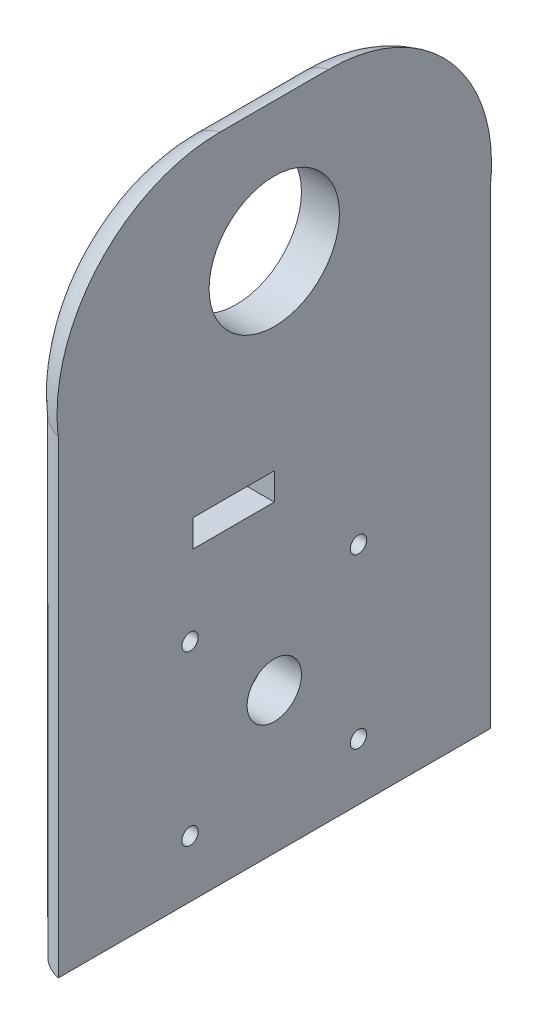
ISO-10303-21;
HEADER;
FILE_DESCRIPTION(('STEP AP214'),'2;1');
FILE_NAME('part.step','',(''),(''),'','','');
FILE_SCHEMA(('AUTOMOTIVE_DESIGN { 1 0 10303 214 1 1 1 1 }'));
ENDSEC;
DATA;
#1=APPLICATION_CONTEXT('core data for automotive mechanical design processes');
#2=APPLICATION_PROTOCOL_DEFINITION('international standard','automotive_design',2000,#1);
#3=PRODUCT_CONTEXT('',#1,'mechanical');
#4=PRODUCT('Part','Part','',(#3));
#5=PRODUCT_RELATED_PRODUCT_CATEGORY('part','',(#4));
#6=PRODUCT_DEFINITION_FORMATION('','',#4);
#7=PRODUCT_DEFINITION_CONTEXT('part definition',#1,'design');
#8=PRODUCT_DEFINITION('design','',#6,#7);
#9=PRODUCT_DEFINITION_SHAPE('','',#8);
#10=(LENGTH_UNIT() NAMED_UNIT(*) SI_UNIT(.MILLI.,.METRE.));
#11=(NAMED_UNIT(*) PLANE_ANGLE_UNIT() SI_UNIT($,.RADIAN.));
#12=(NAMED_UNIT(*) SI_UNIT($,.STERADIAN.) SOLID_ANGLE_UNIT());
#13=UNCERTAINTY_MEASURE_WITH_UNIT(LENGTH_MEASURE(1.E-05),#10,'distance_accuracy_value','');
#14=(GEOMETRIC_REPRESENTATION_CONTEXT(3) GLOBAL_UNCERTAINTY_ASSIGNED_CONTEXT((#13)) GLOBAL_UNIT_ASSIGNED_CONTEXT((#10,
#11,#12)) REPRESENTATION_CONTEXT('',''));
#15=CARTESIAN_POINT('',(0.,0.,0.));
#16=DIRECTION('',(0.,0.,1.));
#17=DIRECTION('',(1.,0.,0.));
#18=AXIS2_PLACEMENT_3D('',#15,#16,#17);
#19=CARTESIAN_POINT('',(7.00000000000001,0.,0.));
#20=DIRECTION('',(1.,0.,0.));
#21=DIRECTION('',(0.,0.,-1.));
#22=AXIS2_PLACEMENT_3D('',#19,#20,#21);
#23=PLANE('',#22);
#24=DIRECTION('',(0.,-1.,0.));
#25=VECTOR('',#24,1.);
#26=CARTESIAN_POINT('',(7.00000000000001,86.3323719205008,-0.22503561260788));
#27=LINE('',#26,#25);
#28=CARTESIAN_POINT('',(7.00000000000001,86.3323719205008,-0.22503561260788));
#29=VERTEX_POINT('',#28);
#30=CARTESIAN_POINT('',(7.00000000000001,0.,-0.225035612607876));
#31=VERTEX_POINT('',#30);
#32=EDGE_CURVE('E134',#29,#31,#27,.T.);
#33=ORIENTED_EDGE('',*,*,#32,.T.);
#34=DIRECTION('',(0.,0.,1.));
#35=VECTOR('',#34,1.);
#36=CARTESIAN_POINT('',(7.00000000000001,0.,0.));
#37=LINE('',#36,#35);
#38=CARTESIAN_POINT('',(7.,0.,-79.7749643873921));
#39=VERTEX_POINT('',#38);
#40=EDGE_CURVE('E137',#39,#31,#37,.T.);
#41=ORIENTED_EDGE('',*,*,#40,.F.);
#42=DIRECTION('',(0.,-1.,0.));
#43=VECTOR('',#42,1.);
#44=CARTESIAN_POINT('',(7.,80.,-79.7749643873921));
#45=LINE('',#44,#43);
#46=CARTESIAN_POINT('',(7.,86.332371920501,-79.7749643873921));
#47=VERTEX_POINT('',#46);
#48=EDGE_CURVE('E123',#39,#47,#45,.F.);
#49=ORIENTED_EDGE('',*,*,#48,.T.);
#50=CARTESIAN_POINT('',(7.,86.332371920501,-79.7749643873921));
#51=CARTESIAN_POINT('',(7.,86.4844238117171,-79.7936939732408));
#52=CARTESIAN_POINT('',(7.,86.6366191929731,-79.81125864016));
#53=CARTESIAN_POINT('',(7.,86.9412611686345,-79.8440544455172));
#54=CARTESIAN_POINT('',(7.,87.09370776304,-79.8592855839552));
#55=CARTESIAN_POINT('',(7.,87.3988163980702,-79.8874106417278));
#56=CARTESIAN_POINT('',(7.,87.5514784386949,-79.9003045610624));
#57=CARTESIAN_POINT('',(7.,87.8569821328588,-79.9237521860107));
#58=CARTESIAN_POINT('',(7.,88.0098237863979,-79.9343058916245));
#59=CARTESIAN_POINT('',(7.,88.3156508352067,-79.9530706016193));
#60=CARTESIAN_POINT('',(7.,88.4686362304764,-79.9612816060004));
#61=CARTESIAN_POINT('',(7.,88.7747148565299,-79.9753589969771));
#62=CARTESIAN_POINT('',(7.,88.9278080873137,-79.9812253835727));
#63=CARTESIAN_POINT('',(7.,89.2340664537782,-79.9906121303581));
#64=CARTESIAN_POINT('',(7.,89.3872315894588,-79.9941324905479));
#65=CARTESIAN_POINT('',(7.,89.6935978158869,-79.9988264748));
#66=CARTESIAN_POINT('',(7.,89.8467989066343,-80.0000000988623));
#67=CARTESIAN_POINT('',(7.,90.,-80.));
#68=B_SPLINE_CURVE_WITH_KNOTS('',3,(#50,#51,#52,#53,#54,#55,#56,#57,#58,#59,#60,#61,#62,#63,#64,
#65,#66,#67),.UNSPECIFIED.,.F.,.F.,(4,2,2,2,2,2,2,2,4),(0.,0.459598781070504,0.919197562141005,
1.37879634321148,1.83839512428197,2.29799390535247,2.75759268642297,3.21719146749346,
3.67679024856396),.UNSPECIFIED.);
#69=CARTESIAN_POINT('',(7.,90.,-80.));
#70=VERTEX_POINT('',#69);
#71=EDGE_CURVE('E142',#47,#70,#68,.T.);
#72=ORIENTED_EDGE('',*,*,#71,.T.);
#73=CARTESIAN_POINT('',(7.,90.,-50.));
#74=DIRECTION('',(-1.,0.,0.));
#75=DIRECTION('',(0.,0.,1.));
#76=AXIS2_PLACEMENT_3D('',#73,#74,#75);
#77=CIRCLE('',#76,30.);
#78=CARTESIAN_POINT('',(7.,120.,-50.));
#79=VERTEX_POINT('',#78);
#80=EDGE_CURVE('E210',#70,#79,#77,.F.);
#81=ORIENTED_EDGE('',*,*,#80,.T.);
#82=DIRECTION('',(0.,0.,-1.));
#83=VECTOR('',#82,1.);
#84=CARTESIAN_POINT('',(7.,120.,-80.));
#85=LINE('',#84,#83);
#86=CARTESIAN_POINT('',(7.,120.,-30.));
#87=VERTEX_POINT('',#86);
#88=EDGE_CURVE('E209',#87,#79,#85,.T.);
#89=ORIENTED_EDGE('',*,*,#88,.F.);
#90=CARTESIAN_POINT('',(7.,90.,-30.));
#91=DIRECTION('',(-1.,0.,0.));
#92=DIRECTION('',(0.,0.,1.));
#93=AXIS2_PLACEMENT_3D('',#90,#91,#92);
#94=CIRCLE('',#93,30.);
#95=CARTESIAN_POINT('',(7.00000000000001,90.,0.));
#96=VERTEX_POINT('',#95);
#97=EDGE_CURVE('E230',#87,#96,#94,.F.);
#98=ORIENTED_EDGE('',*,*,#97,.T.);
#99=CARTESIAN_POINT('',(7.00000000000001,90.,0.));
#100=CARTESIAN_POINT('',(7.00000000000001,89.8467989066343,9.88623379219707E-08));
#101=CARTESIAN_POINT('',(7.00000000000001,89.6935978158869,-0.00117352519996322));
#102=CARTESIAN_POINT('',(7.00000000000001,89.3872315894588,-0.00586750945208815));
#103=CARTESIAN_POINT('',(7.00000000000001,89.2340664537781,-0.00938786964191195));
#104=CARTESIAN_POINT('',(7.00000000000001,88.9278080873136,-0.0187746164273267));
#105=CARTESIAN_POINT('',(7.00000000000001,88.7747148565298,-0.0246410030229177));
#106=CARTESIAN_POINT('',(7.00000000000001,88.4686362304763,-0.0387183939996002));
#107=CARTESIAN_POINT('',(7.00000000000001,88.3156508352066,-0.0469293983806916));
#108=CARTESIAN_POINT('',(7.00000000000001,88.0098237863978,-0.0656941083755351));
#109=CARTESIAN_POINT('',(7.00000000000001,87.8569821328587,-0.0762478139892872));
#110=CARTESIAN_POINT('',(7.00000000000001,87.5514784386948,-0.0996954389376256));
#111=CARTESIAN_POINT('',(7.00000000000001,87.3988163980701,-0.112589358272212));
#112=CARTESIAN_POINT('',(7.00000000000001,87.0937077630398,-0.140714416044798));
#113=CARTESIAN_POINT('',(7.00000000000001,86.9412611686343,-0.155945554482799));
#114=CARTESIAN_POINT('',(7.00000000000001,86.6366191929729,-0.188741359839996));
#115=CARTESIAN_POINT('',(7.00000000000001,86.4844238117169,-0.206306026759193));
#116=CARTESIAN_POINT('',(7.00000000000001,86.3323719205008,-0.22503561260788));
#117=B_SPLINE_CURVE_WITH_KNOTS('',3,(#99,#100,#101,#102,#103,#104,#105,#106,#107,#108,#109,#110,
#111,#112,#113,#114,#115,#116),.UNSPECIFIED.,.F.,.F.,(4,2,2,2,2,2,2,2,4),(0.,0.459598781070525,
0.919197562141053,1.37879634321158,1.8383951242821,2.29799390535263,2.75759268642314,
3.21719146749367,3.67679024856419),.UNSPECIFIED.);
#118=EDGE_CURVE('E327',#96,#29,#117,.T.);
#119=ORIENTED_EDGE('',*,*,#118,.T.);
#120=EDGE_LOOP('',(#33,#41,#49,#72,#81,#89,#98,#119));
#121=FACE_BOUND('',#120,.T.);
#122=CARTESIAN_POINT('',(7.00000000000001,96.,-40.));
#123=DIRECTION('',(-1.,0.,0.));
#124=DIRECTION('',(0.,0.,1.));
#125=AXIS2_PLACEMENT_3D('',#122,#123,#124);
#126=CIRCLE('',#125,12.);
#127=CARTESIAN_POINT('',(7.00000000000001,96.,-28.));
#128=VERTEX_POINT('',#127);
#129=EDGE_CURVE('E260',#128,#128,#126,.T.);
#130=ORIENTED_EDGE('',*,*,#129,.T.);
#131=EDGE_LOOP('',(#130));
#132=FACE_BOUND('',#131,.T.);
#133=CARTESIAN_POINT('',(7.00000000000001,10.5,-55.5000000000003));
#134=DIRECTION('',(-1.,0.,0.));
#135=DIRECTION('',(0.,0.,1.));
#136=AXIS2_PLACEMENT_3D('',#133,#134,#135);
#137=CIRCLE('',#136,1.5);
#138=CARTESIAN_POINT('',(7.00000000000001,10.5,-54.0000000000003));
#139=VERTEX_POINT('',#138);
#140=EDGE_CURVE('E257',#139,#139,#137,.T.);
#141=ORIENTED_EDGE('',*,*,#140,.T.);
#142=EDGE_LOOP('',(#141));
#143=FACE_BOUND('',#142,.T.);
#144=CARTESIAN_POINT('',(7.00000000000001,10.5,-24.5000000000003));
#145=DIRECTION('',(-1.,0.,0.));
#146=DIRECTION('',(0.,0.,1.));
#147=AXIS2_PLACEMENT_3D('',#144,#145,#146);
#148=CIRCLE('',#147,1.5);
#149=CARTESIAN_POINT('',(7.00000000000001,10.5,-23.0000000000003));
#150=VERTEX_POINT('',#149);
#151=EDGE_CURVE('E254',#150,#150,#148,.T.);
#152=ORIENTED_EDGE('',*,*,#151,.T.);
#153=EDGE_LOOP('',(#152));
#154=FACE_BOUND('',#153,.T.);
#155=DIRECTION('',(0.,0.,-1.));
#156=VECTOR('',#155,1.);
#157=CARTESIAN_POINT('',(7.,61.,-80.));
#158=LINE('',#157,#156);
#159=CARTESIAN_POINT('',(7.00000000000001,61.,-25.));
#160=VERTEX_POINT('',#159);
#161=CARTESIAN_POINT('',(7.,61.,-40.));
#162=VERTEX_POINT('',#161);
#163=EDGE_CURVE('E251',#160,#162,#158,.T.);
#164=ORIENTED_EDGE('',*,*,#163,.T.);
#165=DIRECTION('',(0.,-1.,0.));
#166=VECTOR('',#165,1.);
#167=CARTESIAN_POINT('',(7.,120.,-40.0000000000002));
#168=LINE('',#167,#166);
#169=CARTESIAN_POINT('',(7.00000000000001,56.,-40.));
#170=VERTEX_POINT('',#169);
#171=EDGE_CURVE('E244',#162,#170,#168,.T.);
#172=ORIENTED_EDGE('',*,*,#171,.T.);
#173=DIRECTION('',(0.,0.,1.));
#174=VECTOR('',#173,1.);
#175=CARTESIAN_POINT('',(7.,56.,-80.));
#176=LINE('',#175,#174);
#177=CARTESIAN_POINT('',(7.00000000000001,56.,-25.));
#178=VERTEX_POINT('',#177);
#179=EDGE_CURVE('E246',#170,#178,#176,.T.);
#180=ORIENTED_EDGE('',*,*,#179,.T.);
#181=DIRECTION('',(0.,1.,0.));
#182=VECTOR('',#181,1.);
#183=CARTESIAN_POINT('',(7.00000000000001,120.,-25.));
#184=LINE('',#183,#182);
#185=EDGE_CURVE('E248',#178,#160,#184,.T.);
#186=ORIENTED_EDGE('',*,*,#185,.T.);
#187=EDGE_LOOP('',(#164,#172,#180,#186));
#188=FACE_BOUND('',#187,.T.);
#189=CARTESIAN_POINT('',(7.00000000000001,26.,-40.));
#190=DIRECTION('',(-1.,0.,0.));
#191=DIRECTION('',(0.,0.,1.));
#192=AXIS2_PLACEMENT_3D('',#189,#190,#191);
#193=CIRCLE('',#192,5.);
#194=CARTESIAN_POINT('',(7.00000000000001,26.,-35.));
#195=VERTEX_POINT('',#194);
#196=EDGE_CURVE('E241',#195,#195,#193,.T.);
#197=ORIENTED_EDGE('',*,*,#196,.T.);
#198=EDGE_LOOP('',(#197));
#199=FACE_BOUND('',#198,.T.);
#200=CARTESIAN_POINT('',(7.00000000000001,41.5,-24.5));
#201=DIRECTION('',(-1.,0.,0.));
#202=DIRECTION('',(0.,0.,1.));
#203=AXIS2_PLACEMENT_3D('',#200,#201,#202);
#204=CIRCLE('',#203,1.5);
#205=CARTESIAN_POINT('',(7.00000000000001,41.5,-23.));
#206=VERTEX_POINT('',#205);
#207=EDGE_CURVE('E238',#206,#206,#204,.T.);
#208=ORIENTED_EDGE('',*,*,#207,.T.);
#209=EDGE_LOOP('',(#208));
#210=FACE_BOUND('',#209,.T.);
#211=CARTESIAN_POINT('',(7.00000000000001,41.5,-55.5));
#212=DIRECTION('',(-1.,0.,0.));
#213=DIRECTION('',(0.,0.,1.));
#214=AXIS2_PLACEMENT_3D('',#211,#212,#213);
#215=CIRCLE('',#214,1.5);
#216=CARTESIAN_POINT('',(7.00000000000001,41.5,-54.));
#217=VERTEX_POINT('',#216);
#218=EDGE_CURVE('E235',#217,#217,#215,.T.);
#219=ORIENTED_EDGE('',*,*,#218,.T.);
#220=EDGE_LOOP('',(#219));
#221=FACE_BOUND('',#220,.T.);
#222=ADVANCED_FACE('F40',(#121,#132,#143,#154,#188,#199,#210,#221),#23,.T.);
#223=CARTESIAN_POINT('',(0.,0.,0.));
#224=DIRECTION('',(0.,-1.,0.));
#225=DIRECTION('',(0.,0.,-1.));
#226=AXIS2_PLACEMENT_3D('',#223,#224,#225);
#227=PLANE('',#226);
#228=CARTESIAN_POINT('',(9.,0.,-71.));
#229=DIRECTION('',(0.,-1.,0.));
#230=DIRECTION('',(0.,0.,-1.));
#231=AXIS2_PLACEMENT_3D('',#228,#229,#230);
#232=CIRCLE('',#231,9.);
#233=CARTESIAN_POINT('',(0.,0.,-71.));
#234=VERTEX_POINT('',#233);
#235=EDGE_CURVE('E128',#234,#39,#232,.T.);
#236=ORIENTED_EDGE('',*,*,#235,.T.);
#237=ORIENTED_EDGE('',*,*,#40,.T.);
#238=CARTESIAN_POINT('',(9.,0.,-9.));
#239=DIRECTION('',(0.,-1.,0.));
#240=DIRECTION('',(0.,0.,-1.));
#241=AXIS2_PLACEMENT_3D('',#238,#239,#240);
#242=CIRCLE('',#241,9.);
#243=CARTESIAN_POINT('',(0.,0.,-9.));
#244=VERTEX_POINT('',#243);
#245=EDGE_CURVE('E133',#31,#244,#242,.T.);
#246=ORIENTED_EDGE('',*,*,#245,.T.);
#247=DIRECTION('',(0.,0.,1.));
#248=VECTOR('',#247,1.);
#249=CARTESIAN_POINT('',(0.,0.,0.));
#250=LINE('',#249,#248);
#251=EDGE_CURVE('E147',#234,#244,#250,.T.);
#252=ORIENTED_EDGE('',*,*,#251,.F.);
#253=EDGE_LOOP('',(#236,#237,#246,#252));
#254=FACE_BOUND('',#253,.T.);
#255=ADVANCED_FACE('F145',(#254),#227,.T.);
#256=CARTESIAN_POINT('',(9.,80.,-71.));
#257=DIRECTION('',(0.,-1.,0.));
#258=DIRECTION('',(0.,0.,-1.));
#259=AXIS2_PLACEMENT_3D('',#256,#257,#258);
#260=CYLINDRICAL_SURFACE('',#259,9.);
#261=ORIENTED_EDGE('',*,*,#48,.F.);
#262=ORIENTED_EDGE('',*,*,#235,.F.);
#263=DIRECTION('',(0.,-1.,0.));
#264=VECTOR('',#263,1.);
#265=CARTESIAN_POINT('',(0.,80.,-71.));
#266=LINE('',#265,#264);
#267=CARTESIAN_POINT('',(0.,86.9174463903328,-71.));
#268=VERTEX_POINT('',#267);
#269=EDGE_CURVE('E208',#268,#234,#266,.T.);
#270=ORIENTED_EDGE('',*,*,#269,.F.);
#271=CARTESIAN_POINT('',(17.1120658559973,86.6449272075602,-74.8979978896816));
#272=CARTESIAN_POINT('',(17.0025233549063,86.6296322569458,-75.126027909353));
#273=CARTESIAN_POINT('',(16.8833093516158,86.6147524338567,-75.3494352765005));
#274=CARTESIAN_POINT('',(16.6264828009461,86.5858905522271,-75.7854619530367));
#275=CARTESIAN_POINT('',(16.4888709390154,86.5719084602686,-75.9980816639339));
#276=CARTESIAN_POINT('',(16.1962768271869,86.5449168876101,-76.4108777012592));
#277=CARTESIAN_POINT('',(16.0413055512613,86.5319068010203,-76.6110617659807));
#278=CARTESIAN_POINT('',(15.7150236659178,86.5069087819546,-76.9977024433949));
#279=CARTESIAN_POINT('',(15.5437133018826,86.4949208341331,-77.184159262171));
#280=CARTESIAN_POINT('',(15.1858667018349,86.4720145848228,-77.5421046415927));
#281=CARTESIAN_POINT('',(14.9993226877017,86.4610968361041,-77.7135854620305));
#282=CARTESIAN_POINT('',(14.612403383978,86.4403855338573,-78.0402437370061));
#283=CARTESIAN_POINT('',(14.4120278193592,86.4305920026937,-78.1954208672043));
#284=CARTESIAN_POINT('',(13.9989178795064,86.4121735857264,-78.4883187674557));
#285=CARTESIAN_POINT('',(13.7861863065341,86.4035484364086,-78.6260434732346));
#286=CARTESIAN_POINT('',(13.349836985107,86.3875007180007,-78.8830854002579));
#287=CARTESIAN_POINT('',(13.1262193037495,86.3800781414996,-79.0024027349386));
#288=CARTESIAN_POINT('',(12.6700052541864,86.3664759361732,-79.2216190464963));
#289=CARTESIAN_POINT('',(12.4374217339087,86.3602946022055,-79.321544656101));
#290=CARTESIAN_POINT('',(11.964641307076,86.349187554692,-79.5014630660415));
#291=CARTESIAN_POINT('',(11.7244444548299,86.3442618321918,-79.5814560085285));
#292=CARTESIAN_POINT('',(11.2381129057099,86.3356854899489,-79.7209433755051));
#293=CARTESIAN_POINT('',(10.9919773996816,86.3320350450265,-79.7804349895742));
#294=CARTESIAN_POINT('',(10.4955554478808,86.3260250303049,-79.8784753572502));
#295=CARTESIAN_POINT('',(10.2452690251416,86.3236654533453,-79.9170242270274));
#296=CARTESIAN_POINT('',(9.74431392869058,86.3202601593651,-79.9726812940555));
#297=CARTESIAN_POINT('',(9.4936638190599,86.31920423253,-79.9899561009667));
#298=CARTESIAN_POINT('',(8.99170947974394,86.3183763655687,-80.0034986192258));
#299=CARTESIAN_POINT('',(8.74040505809832,86.3186048582341,-79.9997592497416));
#300=CARTESIAN_POINT('',(8.23905337704522,86.3203457310569,-79.9712867665032));
#301=CARTESIAN_POINT('',(7.98900583062906,86.3218578033339,-79.9465586871199));
#302=CARTESIAN_POINT('',(7.49185781078122,86.3261594615022,-79.8762904680205));
#303=CARTESIAN_POINT('',(7.24475740839572,86.3289490781274,-79.8307498276167));
#304=CARTESIAN_POINT('',(6.75349666677686,86.3358191789912,-79.7187810136147));
#305=CARTESIAN_POINT('',(6.50936987326081,86.3399087294127,-79.6522061605287));
#306=CARTESIAN_POINT('',(6.02760776945707,86.3493558027826,-79.4987526092848));
#307=CARTESIAN_POINT('',(5.78997249183444,86.3547133321102,-79.4118738089795));
#308=CARTESIAN_POINT('',(5.32288411110817,86.3666744206638,-79.2184375479486));
#309=CARTESIAN_POINT('',(5.09343098861722,86.3732779769373,-79.1118801338545));
#310=CARTESIAN_POINT('',(4.64434027508894,86.3877037044129,-78.8798544909191));
#311=CARTESIAN_POINT('',(4.42470248766182,86.3955258512188,-78.7543866406664));
#312=CARTESIAN_POINT('',(3.99679842431334,86.4123560268681,-78.4854412855514));
#313=CARTESIAN_POINT('',(3.78853194907225,86.4213640349159,-78.3419640965077));
#314=CARTESIAN_POINT('',(3.38490974700962,86.4405245813919,-78.0380788554198));
#315=CARTESIAN_POINT('',(3.18954961168861,86.4506767257704,-77.877676633697));
#316=CARTESIAN_POINT('',(2.81295144023854,86.4720894553229,-77.5409678211372));
#317=CARTESIAN_POINT('',(2.63172014166022,86.4833505636003,-77.3646537279067));
#318=CARTESIAN_POINT('',(2.28476376660721,86.5069275233157,-76.997449923066));
#319=CARTESIAN_POINT('',(2.11903836840218,86.5192433528592,-76.8065605140267));
#320=CARTESIAN_POINT('',(1.80398551017772,86.5448966978584,-76.4112264095434));
#321=CARTESIAN_POINT('',(1.65468656391395,86.5582359237308,-76.2067591013461));
#322=CARTESIAN_POINT('',(1.37386554890301,86.5858559068859,-75.7860257037704));
#323=CARTESIAN_POINT('',(1.24234324169172,86.6001366515348,-75.5697597727189));
#324=CARTESIAN_POINT('',(0.998139712007094,86.6295549160713,-75.1272295084597));
#325=CARTESIAN_POINT('',(0.88543645698999,86.644691405887,-74.9009772649655));
#326=CARTESIAN_POINT('',(0.679506285843596,86.6757571380358,-74.4399281942448));
#327=CARTESIAN_POINT('',(0.586272446007552,86.6916860960478,-74.2051344395454));
#328=CARTESIAN_POINT('',(0.416767962926865,86.7248705452736,-73.7196823067576));
#329=CARTESIAN_POINT('',(0.341260893375457,86.7421533608764,-73.4687589230089));
#330=CARTESIAN_POINT('',(0.212449436714814,86.7773845359987,-72.9614754715356));
#331=CARTESIAN_POINT('',(0.159131658048242,86.795332486955,-72.7051187813631));
#332=CARTESIAN_POINT('',(0.0794519027059349,86.8298766344923,-72.2159833983466));
#333=CARTESIAN_POINT('',(0.0508439140784731,86.8464163538502,-71.9835620497173));
#334=CARTESIAN_POINT('',(0.0118366197095676,86.8798661096679,-71.5172945099493));
#335=CARTESIAN_POINT('',(0.00142754890707298,86.8967759425993,-71.2834491505363));
#336=CARTESIAN_POINT('',(4.56127275312073E-05,86.9150304592026,-71.0331033051339));
#337=CARTESIAN_POINT('',(-5.15878953618364E-08,86.9162380887258,-71.0165513764534));
#338=CARTESIAN_POINT('',(0.,86.9174463903328,-71.));
#339=B_SPLINE_CURVE_WITH_KNOTS('',3,(#271,#272,#273,#274,#275,#276,#277,#278,#279,#280,#281,
#282,#283,#284,#285,#286,#287,#288,#289,#290,#291,#292,#293,#294,#295,#296,#297,#298,#299,#300,
#301,#302,#303,#304,#305,#306,#307,#308,#309,#310,#311,#312,#313,#314,#315,#316,#317,#318,#319,
#320,#321,#322,#323,#324,#325,#326,#327,#328,#329,#330,#331,#332,#333,#334,#335,#336,#337,#338),
.UNSPECIFIED.,.F.,.F.,(4,2,2,2,2,2,2,2,2,2,2,2,2,2,2,2,2,2,2,2,2,2,2,2,2,2,2,2,2,2,2,2,2,4),(0.,
0.760086418244916,1.5201445258547,2.2797248362133,3.03929374087657,3.79925292677073,
4.55922722814799,5.31902984027922,6.0788277699062,6.83757468581152,7.59631619050568,
8.35516166579197,9.11400293169017,9.8668626769478,10.6199761172796,11.3729089661763,
12.1258599293269,12.8841819077575,13.6425077013302,14.4008316979581,15.1591405148869,
15.9174360356837,16.6754711870204,17.4338656355216,18.1922443446835,18.9519193755602,
19.7115842147901,20.4703533384076,21.2288521675555,22.0156788673609,22.8020300148469,
23.5056404531504,24.2088732365832,24.258660905081),.UNSPECIFIED.);
#340=EDGE_CURVE('E130',#47,#268,#339,.T.);
#341=ORIENTED_EDGE('',*,*,#340,.F.);
#342=EDGE_LOOP('',(#261,#262,#270,#341));
#343=FACE_BOUND('',#342,.T.);
#344=ADVANCED_FACE('F125',(#343),#260,.T.);
#345=CARTESIAN_POINT('',(9.,80.,-9.));
#346=DIRECTION('',(0.,-1.,0.));
#347=DIRECTION('',(0.,0.,-1.));
#348=AXIS2_PLACEMENT_3D('',#345,#346,#347);
#349=CYLINDRICAL_SURFACE('',#348,9.);
#350=ORIENTED_EDGE('',*,*,#245,.F.);
#351=ORIENTED_EDGE('',*,*,#32,.F.);
#352=CARTESIAN_POINT('',(17.1120658559973,86.6449272075601,-5.10200211031836));
#353=CARTESIAN_POINT('',(17.0025233549063,86.6296322569458,-4.87397209064698));
#354=CARTESIAN_POINT('',(16.8833093516158,86.6147524338566,-4.6505647234995));
#355=CARTESIAN_POINT('',(16.6264828009461,86.5858905522271,-4.21453804696332));
#356=CARTESIAN_POINT('',(16.4888709390154,86.5719084602686,-4.00191833606607));
#357=CARTESIAN_POINT('',(16.1962768271869,86.54491688761,-3.5891222987408));
#358=CARTESIAN_POINT('',(16.0413055512613,86.5319068010203,-3.38893823401933));
#359=CARTESIAN_POINT('',(15.7150236659178,86.5069087819546,-3.00229755660509));
#360=CARTESIAN_POINT('',(15.5437133018826,86.494920834133,-2.81584073782898));
#361=CARTESIAN_POINT('',(15.1858667018348,86.4720145848228,-2.45789535840729));
#362=CARTESIAN_POINT('',(14.9993226877017,86.461096836104,-2.2864145379695));
#363=CARTESIAN_POINT('',(14.612403383978,86.4403855338573,-1.95975626299391));
#364=CARTESIAN_POINT('',(14.4120278193592,86.4305920026937,-1.80457913279566));
#365=CARTESIAN_POINT('',(13.9989178795064,86.4121735857264,-1.51168123254431));
#366=CARTESIAN_POINT('',(13.786186306534,86.4035484364086,-1.37395652676544));
#367=CARTESIAN_POINT('',(13.349836985107,86.3875007180006,-1.11691459974209));
#368=CARTESIAN_POINT('',(13.1262193037495,86.3800781414995,-0.997597265061363));
#369=CARTESIAN_POINT('',(12.6700052541864,86.3664759361732,-0.778380953503677));
#370=CARTESIAN_POINT('',(12.4374217339086,86.3602946022055,-0.678455343899008));
#371=CARTESIAN_POINT('',(11.964641307076,86.349187554692,-0.498536933958522));
#372=CARTESIAN_POINT('',(11.7244444548298,86.3442618321917,-0.418543991471506));
#373=CARTESIAN_POINT('',(11.2381129057099,86.3356854899488,-0.279056624494874));
#374=CARTESIAN_POINT('',(10.9919773996816,86.3320350450265,-0.219565010425816));
#375=CARTESIAN_POINT('',(10.4955554478808,86.3260250303049,-0.1215246427498));
#376=CARTESIAN_POINT('',(10.2452690251416,86.3236654533452,-0.0829757729726319));
#377=CARTESIAN_POINT('',(9.74431392869055,86.3202601593651,-0.0273187059444969));
#378=CARTESIAN_POINT('',(9.49366381905988,86.3192042325299,-0.0100438990332734));
#379=CARTESIAN_POINT('',(8.99170947974393,86.3183763655686,0.00349861922583641));
#380=CARTESIAN_POINT('',(8.74040505809831,86.318604858234,-0.000240750258406406));
#381=CARTESIAN_POINT('',(8.23905337704521,86.3203457310569,-0.0287132334968042));
#382=CARTESIAN_POINT('',(7.98900583062906,86.3218578033338,-0.0534413128801237));
#383=CARTESIAN_POINT('',(7.49185781078123,86.3261594615021,-0.123709531979558));
#384=CARTESIAN_POINT('',(7.24475740839573,86.3289490781273,-0.169250172383311));
#385=CARTESIAN_POINT('',(6.75349666677687,86.3358191789912,-0.28121898638524));
#386=CARTESIAN_POINT('',(6.50936987326082,86.3399087294126,-0.347793839471335));
#387=CARTESIAN_POINT('',(6.02760776945709,86.3493558027826,-0.501247390715169));
#388=CARTESIAN_POINT('',(5.78997249183445,86.3547133321101,-0.588126191020517));
#389=CARTESIAN_POINT('',(5.32288411110818,86.3666744206638,-0.781562452051414));
#390=CARTESIAN_POINT('',(5.09343098861723,86.3732779769372,-0.888119866145507));
#391=CARTESIAN_POINT('',(4.64434027508895,86.3877037044128,-1.12014550908094));
#392=CARTESIAN_POINT('',(4.42470248766182,86.3955258512188,-1.24561335933364));
#393=CARTESIAN_POINT('',(3.99679842431335,86.4123560268681,-1.51455871444858));
#394=CARTESIAN_POINT('',(3.78853194907226,86.4213640349159,-1.65803590349227));
#395=CARTESIAN_POINT('',(3.38490974700963,86.4405245813918,-1.96192114458023));
#396=CARTESIAN_POINT('',(3.18954961168862,86.4506767257704,-2.12232336630304));
#397=CARTESIAN_POINT('',(2.81295144023856,86.4720894553229,-2.4590321788628));
#398=CARTESIAN_POINT('',(2.63172014166024,86.4833505636003,-2.63534627209325));
#399=CARTESIAN_POINT('',(2.28476376660722,86.5069275233157,-3.00255007693401));
#400=CARTESIAN_POINT('',(2.1190383684022,86.5192433528592,-3.19343948597328));
#401=CARTESIAN_POINT('',(1.80398551017774,86.5448966978584,-3.58877359045655));
#402=CARTESIAN_POINT('',(1.65468656391396,86.5582359237308,-3.7932408986539));
#403=CARTESIAN_POINT('',(1.37386554890303,86.5858559068859,-4.21397429622961));
#404=CARTESIAN_POINT('',(1.24234324169174,86.6001366515348,-4.43024022728109));
#405=CARTESIAN_POINT('',(0.998139712007106,86.6295549160712,-4.87277049154031));
#406=CARTESIAN_POINT('',(0.885436456989999,86.6446914058869,-5.09902273503447));
#407=CARTESIAN_POINT('',(0.679506285843603,86.6757571380357,-5.56007180575518));
#408=CARTESIAN_POINT('',(0.586272446007558,86.6916860960478,-5.79486556045458));
#409=CARTESIAN_POINT('',(0.416767962926874,86.7248705452736,-6.28031769324242));
#410=CARTESIAN_POINT('',(0.341260893375469,86.7421533608762,-6.53124107699109));
#411=CARTESIAN_POINT('',(0.212449436714829,86.7773845359988,-7.03852452846431));
#412=CARTESIAN_POINT('',(0.159131658048257,86.7953324869556,-7.29488121863677));
#413=CARTESIAN_POINT('',(0.0794519027059451,86.8298766344916,-7.78401660165337));
#414=CARTESIAN_POINT('',(0.0508439140784815,86.846416353848,-8.01643795028275));
#415=CARTESIAN_POINT('',(0.0118366197095665,86.8798661096697,-8.48270549005058));
#416=CARTESIAN_POINT('',(0.00142754890706441,86.8967759426065,-8.7165508494632));
#417=CARTESIAN_POINT('',(4.56127275301204E-05,86.9150304592035,-8.96689669486603));
#418=CARTESIAN_POINT('',(-5.15878958843369E-08,86.9162380887264,-8.98344862354661));
#419=CARTESIAN_POINT('',(0.,86.9174463903327,-9.));
#420=B_SPLINE_CURVE_WITH_KNOTS('',3,(#352,#353,#354,#355,#356,#357,#358,#359,#360,#361,#362,
#363,#364,#365,#366,#367,#368,#369,#370,#371,#372,#373,#374,#375,#376,#377,#378,#379,#380,#381,
#382,#383,#384,#385,#386,#387,#388,#389,#390,#391,#392,#393,#394,#395,#396,#397,#398,#399,#400,
#401,#402,#403,#404,#405,#406,#407,#408,#409,#410,#411,#412,#413,#414,#415,#416,#417,#418,#419),
.UNSPECIFIED.,.F.,.F.,(4,2,2,2,2,2,2,2,2,2,2,2,2,2,2,2,2,2,2,2,2,2,2,2,2,2,2,2,2,2,2,2,2,4),(0.,
0.760086418244919,1.5201445258547,2.27972483621332,3.03929374087658,3.79925292677074,
4.559227228148,5.31902984027923,6.07882776990622,6.83757468581154,7.5963161905057,
8.35516166579199,9.11400293169019,9.86686267694781,10.6199761172796,11.3729089661763,
12.1258599293268,12.8841819077574,13.6425077013301,14.4008316979581,15.1591405148869,
15.9174360356836,16.6754711870204,17.4338656355216,18.1922443446835,18.9519193755602,
19.7115842147901,20.4703533384076,21.2288521675555,22.0156788673608,22.8020300148467,
23.5056404531504,24.2088732365833,24.258660905081),.UNSPECIFIED.);
#421=CARTESIAN_POINT('',(0.,86.9174463903327,-9.));
#422=VERTEX_POINT('',#421);
#423=EDGE_CURVE('E51',#422,#29,#420,.F.);
#424=ORIENTED_EDGE('',*,*,#423,.F.);
#425=DIRECTION('',(0.,-1.,0.));
#426=VECTOR('',#425,1.);
#427=CARTESIAN_POINT('',(0.,80.,-9.));
#428=LINE('',#427,#426);
#429=EDGE_CURVE('E148',#244,#422,#428,.F.);
#430=ORIENTED_EDGE('',*,*,#429,.F.);
#431=EDGE_LOOP('',(#350,#351,#424,#430));
#432=FACE_BOUND('',#431,.T.);
#433=ADVANCED_FACE('F42',(#432),#349,.T.);
#434=CARTESIAN_POINT('',(0.,80.,0.));
#435=DIRECTION('',(1.,0.,0.));
#436=DIRECTION('',(0.,0.,-1.));
#437=AXIS2_PLACEMENT_3D('',#434,#435,#436);
#438=PLANE('',#437);
#439=CARTESIAN_POINT('',(0.,41.5,-55.5));
#440=DIRECTION('',(1.,0.,0.));
#441=DIRECTION('',(0.,0.,-1.));
#442=AXIS2_PLACEMENT_3D('',#439,#440,#441);
#443=CIRCLE('',#442,1.5);
#444=CARTESIAN_POINT('',(0.,41.5,-57.));
#445=VERTEX_POINT('',#444);
#446=EDGE_CURVE('E180',#445,#445,#443,.F.);
#447=ORIENTED_EDGE('',*,*,#446,.F.);
#448=EDGE_LOOP('',(#447));
#449=FACE_BOUND('',#448,.T.);
#450=CARTESIAN_POINT('',(0.,41.5,-24.5));
#451=DIRECTION('',(1.,0.,0.));
#452=DIRECTION('',(0.,0.,-1.));
#453=AXIS2_PLACEMENT_3D('',#450,#451,#452);
#454=CIRCLE('',#453,1.5);
#455=CARTESIAN_POINT('',(0.,41.5,-26.));
#456=VERTEX_POINT('',#455);
#457=EDGE_CURVE('E184',#456,#456,#454,.F.);
#458=ORIENTED_EDGE('',*,*,#457,.F.);
#459=EDGE_LOOP('',(#458));
#460=FACE_BOUND('',#459,.T.);
#461=CARTESIAN_POINT('',(0.,26.,-40.));
#462=DIRECTION('',(1.,0.,0.));
#463=DIRECTION('',(0.,0.,-1.));
#464=AXIS2_PLACEMENT_3D('',#461,#462,#463);
#465=CIRCLE('',#464,5.);
#466=CARTESIAN_POINT('',(0.,26.,-45.));
#467=VERTEX_POINT('',#466);
#468=EDGE_CURVE('E174',#467,#467,#465,.F.);
#469=ORIENTED_EDGE('',*,*,#468,.F.);
#470=EDGE_LOOP('',(#469));
#471=FACE_BOUND('',#470,.T.);
#472=DIRECTION('',(0.,0.,1.));
#473=VECTOR('',#472,1.);
#474=CARTESIAN_POINT('',(0.,56.,-40.));
#475=LINE('',#474,#473);
#476=CARTESIAN_POINT('',(0.,56.,-40.));
#477=VERTEX_POINT('',#476);
#478=CARTESIAN_POINT('',(0.,56.,-25.));
#479=VERTEX_POINT('',#478);
#480=EDGE_CURVE('E58',#477,#479,#475,.T.);
#481=ORIENTED_EDGE('',*,*,#480,.F.);
#482=DIRECTION('',(0.,-1.,0.));
#483=VECTOR('',#482,1.);
#484=CARTESIAN_POINT('',(0.,56.,-40.));
#485=LINE('',#484,#483);
#486=CARTESIAN_POINT('',(0.,61.,-40.));
#487=VERTEX_POINT('',#486);
#488=EDGE_CURVE('E171',#487,#477,#485,.T.);
#489=ORIENTED_EDGE('',*,*,#488,.F.);
#490=DIRECTION('',(0.,0.,-1.));
#491=VECTOR('',#490,1.);
#492=CARTESIAN_POINT('',(0.,61.,-40.));
#493=LINE('',#492,#491);
#494=CARTESIAN_POINT('',(0.,61.,-25.));
#495=VERTEX_POINT('',#494);
#496=EDGE_CURVE('E178',#495,#487,#493,.T.);
#497=ORIENTED_EDGE('',*,*,#496,.F.);
#498=DIRECTION('',(0.,1.,0.));
#499=VECTOR('',#498,1.);
#500=CARTESIAN_POINT('',(0.,56.,-25.));
#501=LINE('',#500,#499);
#502=EDGE_CURVE('E162',#479,#495,#501,.T.);
#503=ORIENTED_EDGE('',*,*,#502,.F.);
#504=EDGE_LOOP('',(#481,#489,#497,#503));
#505=FACE_BOUND('',#504,.T.);
#506=CARTESIAN_POINT('',(0.,10.5,-24.5000000000003));
#507=DIRECTION('',(1.,0.,0.));
#508=DIRECTION('',(0.,0.,-1.));
#509=AXIS2_PLACEMENT_3D('',#506,#507,#508);
#510=CIRCLE('',#509,1.5);
#511=CARTESIAN_POINT('',(0.,10.5,-26.0000000000003));
#512=VERTEX_POINT('',#511);
#513=EDGE_CURVE('E187',#512,#512,#510,.F.);
#514=ORIENTED_EDGE('',*,*,#513,.F.);
#515=EDGE_LOOP('',(#514));
#516=FACE_BOUND('',#515,.T.);
#517=CARTESIAN_POINT('',(0.,10.5,-55.5000000000003));
#518=DIRECTION('',(1.,0.,0.));
#519=DIRECTION('',(0.,0.,-1.));
#520=AXIS2_PLACEMENT_3D('',#517,#518,#519);
#521=CIRCLE('',#520,1.5);
#522=CARTESIAN_POINT('',(0.,10.5,-57.0000000000003));
#523=VERTEX_POINT('',#522);
#524=EDGE_CURVE('E183',#523,#523,#521,.F.);
#525=ORIENTED_EDGE('',*,*,#524,.F.);
#526=EDGE_LOOP('',(#525));
#527=FACE_BOUND('',#526,.T.);
#528=CARTESIAN_POINT('',(0.,96.,-40.));
#529=DIRECTION('',(1.,0.,0.));
#530=DIRECTION('',(0.,0.,-1.));
#531=AXIS2_PLACEMENT_3D('',#528,#529,#530);
#532=CIRCLE('',#531,12.);
#533=CARTESIAN_POINT('',(0.,96.,-52.));
#534=VERTEX_POINT('',#533);
#535=EDGE_CURVE('E157',#534,#534,#532,.F.);
#536=ORIENTED_EDGE('',*,*,#535,.F.);
#537=EDGE_LOOP('',(#536));
#538=FACE_BOUND('',#537,.T.);
#539=ORIENTED_EDGE('',*,*,#251,.T.);
#540=ORIENTED_EDGE('',*,*,#429,.T.);
#541=CARTESIAN_POINT('',(0.,90.,-30.));
#542=DIRECTION('',(1.,0.,0.));
#543=DIRECTION('',(0.,0.,-1.));
#544=AXIS2_PLACEMENT_3D('',#541,#542,#543);
#545=CIRCLE('',#544,21.2250356126079);
#546=CARTESIAN_POINT('',(0.,111.225035612608,-30.));
#547=VERTEX_POINT('',#546);
#548=EDGE_CURVE('E150',#422,#547,#545,.F.);
#549=ORIENTED_EDGE('',*,*,#548,.T.);
#550=DIRECTION('',(0.,0.,1.));
#551=VECTOR('',#550,1.);
#552=CARTESIAN_POINT('',(0.,111.225035612608,0.));
#553=LINE('',#552,#551);
#554=CARTESIAN_POINT('',(0.,111.225035612608,-50.));
#555=VERTEX_POINT('',#554);
#556=EDGE_CURVE('E223',#547,#555,#553,.F.);
#557=ORIENTED_EDGE('',*,*,#556,.T.);
#558=CARTESIAN_POINT('',(0.,90.,-50.));
#559=DIRECTION('',(1.,0.,0.));
#560=DIRECTION('',(0.,0.,-1.));
#561=AXIS2_PLACEMENT_3D('',#558,#559,#560);
#562=CIRCLE('',#561,21.2250356126079);
#563=EDGE_CURVE('E225',#555,#268,#562,.F.);
#564=ORIENTED_EDGE('',*,*,#563,.T.);
#565=ORIENTED_EDGE('',*,*,#269,.T.);
#566=EDGE_LOOP('',(#539,#540,#549,#557,#564,#565));
#567=FACE_BOUND('',#566,.T.);
#568=ADVANCED_FACE('F196',(#449,#460,#471,#505,#516,#527,#538,#567),#438,.F.);
#569=CARTESIAN_POINT('',(-145.664271528745,96.,-40.));
#570=DIRECTION('',(1.,0.,0.));
#571=DIRECTION('',(0.,0.,-1.));
#572=AXIS2_PLACEMENT_3D('',#569,#570,#571);
#573=CYLINDRICAL_SURFACE('',#572,12.);
#574=ORIENTED_EDGE('',*,*,#535,.T.);
#575=EDGE_LOOP('',(#574));
#576=FACE_BOUND('',#575,.T.);
#577=ORIENTED_EDGE('',*,*,#129,.F.);
#578=EDGE_LOOP('',(#577));
#579=FACE_BOUND('',#578,.T.);
#580=ADVANCED_FACE('F199',(#576,#579),#573,.F.);
#581=CARTESIAN_POINT('',(-145.664271528745,10.5,-55.5000000000003));
#582=DIRECTION('',(1.,0.,0.));
#583=DIRECTION('',(0.,0.,-1.));
#584=AXIS2_PLACEMENT_3D('',#581,#582,#583);
#585=CYLINDRICAL_SURFACE('',#584,1.5);
#586=ORIENTED_EDGE('',*,*,#524,.T.);
#587=EDGE_LOOP('',(#586));
#588=FACE_BOUND('',#587,.T.);
#589=ORIENTED_EDGE('',*,*,#140,.F.);
#590=EDGE_LOOP('',(#589));
#591=FACE_BOUND('',#590,.T.);
#592=ADVANCED_FACE('F193',(#588,#591),#585,.F.);
#593=CARTESIAN_POINT('',(-145.664271528745,10.5,-24.5000000000003));
#594=DIRECTION('',(1.,0.,0.));
#595=DIRECTION('',(0.,0.,-1.));
#596=AXIS2_PLACEMENT_3D('',#593,#594,#595);
#597=CYLINDRICAL_SURFACE('',#596,1.5);
#598=ORIENTED_EDGE('',*,*,#513,.T.);
#599=EDGE_LOOP('',(#598));
#600=FACE_BOUND('',#599,.T.);
#601=ORIENTED_EDGE('',*,*,#151,.F.);
#602=EDGE_LOOP('',(#601));
#603=FACE_BOUND('',#602,.T.);
#604=ADVANCED_FACE('F419',(#600,#603),#597,.F.);
#605=CARTESIAN_POINT('',(-145.664271528745,56.,-40.));
#606=DIRECTION('',(0.,0.,-1.));
#607=DIRECTION('',(0.,1.,0.));
#608=AXIS2_PLACEMENT_3D('',#605,#606,#607);
#609=PLANE('',#608);
#610=DIRECTION('',(1.,0.,0.));
#611=VECTOR('',#610,1.);
#612=CARTESIAN_POINT('',(-145.664271528745,61.,-40.));
#613=LINE('',#612,#611);
#614=EDGE_CURVE('E154',#487,#162,#613,.T.);
#615=ORIENTED_EDGE('',*,*,#614,.F.);
#616=ORIENTED_EDGE('',*,*,#488,.T.);
#617=DIRECTION('',(1.,0.,0.));
#618=VECTOR('',#617,1.);
#619=CARTESIAN_POINT('',(-145.664271528745,56.,-40.));
#620=LINE('',#619,#618);
#621=EDGE_CURVE('E45',#477,#170,#620,.T.);
#622=ORIENTED_EDGE('',*,*,#621,.T.);
#623=ORIENTED_EDGE('',*,*,#171,.F.);
#624=EDGE_LOOP('',(#615,#616,#622,#623));
#625=FACE_BOUND('',#624,.T.);
#626=ADVANCED_FACE('F410',(#625),#609,.F.);
#627=CARTESIAN_POINT('',(-145.664271528745,56.,-40.));
#628=DIRECTION('',(0.,-1.,0.));
#629=DIRECTION('',(0.,0.,-1.));
#630=AXIS2_PLACEMENT_3D('',#627,#628,#629);
#631=PLANE('',#630);
#632=ORIENTED_EDGE('',*,*,#621,.F.);
#633=ORIENTED_EDGE('',*,*,#480,.T.);
#634=DIRECTION('',(1.,0.,0.));
#635=VECTOR('',#634,1.);
#636=CARTESIAN_POINT('',(-145.664271528745,56.,-25.));
#637=LINE('',#636,#635);
#638=EDGE_CURVE('E159',#479,#178,#637,.T.);
#639=ORIENTED_EDGE('',*,*,#638,.T.);
#640=ORIENTED_EDGE('',*,*,#179,.F.);
#641=EDGE_LOOP('',(#632,#633,#639,#640));
#642=FACE_BOUND('',#641,.T.);
#643=ADVANCED_FACE('F401',(#642),#631,.F.);
#644=CARTESIAN_POINT('',(-145.664271528745,56.,-25.));
#645=DIRECTION('',(0.,0.,1.));
#646=DIRECTION('',(1.,0.,0.));
#647=AXIS2_PLACEMENT_3D('',#644,#645,#646);
#648=PLANE('',#647);
#649=ORIENTED_EDGE('',*,*,#638,.F.);
#650=ORIENTED_EDGE('',*,*,#502,.T.);
#651=DIRECTION('',(1.,0.,0.));
#652=VECTOR('',#651,1.);
#653=CARTESIAN_POINT('',(-145.664271528745,61.,-25.));
#654=LINE('',#653,#652);
#655=EDGE_CURVE('E156',#495,#160,#654,.T.);
#656=ORIENTED_EDGE('',*,*,#655,.T.);
#657=ORIENTED_EDGE('',*,*,#185,.F.);
#658=EDGE_LOOP('',(#649,#650,#656,#657));
#659=FACE_BOUND('',#658,.T.);
#660=ADVANCED_FACE('F391',(#659),#648,.F.);
#661=CARTESIAN_POINT('',(-145.664271528745,61.,-40.));
#662=DIRECTION('',(0.,1.,0.));
#663=DIRECTION('',(0.,0.,1.));
#664=AXIS2_PLACEMENT_3D('',#661,#662,#663);
#665=PLANE('',#664);
#666=ORIENTED_EDGE('',*,*,#655,.F.);
#667=ORIENTED_EDGE('',*,*,#496,.T.);
#668=ORIENTED_EDGE('',*,*,#614,.T.);
#669=ORIENTED_EDGE('',*,*,#163,.F.);
#670=EDGE_LOOP('',(#666,#667,#668,#669));
#671=FACE_BOUND('',#670,.T.);
#672=ADVANCED_FACE('F380',(#671),#665,.F.);
#673=CARTESIAN_POINT('',(-145.664271528745,26.,-40.));
#674=DIRECTION('',(1.,0.,0.));
#675=DIRECTION('',(0.,0.,-1.));
#676=AXIS2_PLACEMENT_3D('',#673,#674,#675);
#677=CYLINDRICAL_SURFACE('',#676,5.);
#678=ORIENTED_EDGE('',*,*,#468,.T.);
#679=EDGE_LOOP('',(#678));
#680=FACE_BOUND('',#679,.T.);
#681=ORIENTED_EDGE('',*,*,#196,.F.);
#682=EDGE_LOOP('',(#681));
#683=FACE_BOUND('',#682,.T.);
#684=ADVANCED_FACE('F294',(#680,#683),#677,.F.);
#685=CARTESIAN_POINT('',(-145.664271528745,41.5,-24.5));
#686=DIRECTION('',(1.,0.,0.));
#687=DIRECTION('',(0.,0.,-1.));
#688=AXIS2_PLACEMENT_3D('',#685,#686,#687);
#689=CYLINDRICAL_SURFACE('',#688,1.5);
#690=ORIENTED_EDGE('',*,*,#457,.T.);
#691=EDGE_LOOP('',(#690));
#692=FACE_BOUND('',#691,.T.);
#693=ORIENTED_EDGE('',*,*,#207,.F.);
#694=EDGE_LOOP('',(#693));
#695=FACE_BOUND('',#694,.T.);
#696=ADVANCED_FACE('F284',(#692,#695),#689,.F.);
#697=CARTESIAN_POINT('',(-145.664271528745,41.5,-55.5));
#698=DIRECTION('',(1.,0.,0.));
#699=DIRECTION('',(0.,0.,-1.));
#700=AXIS2_PLACEMENT_3D('',#697,#698,#699);
#701=CYLINDRICAL_SURFACE('',#700,1.5);
#702=ORIENTED_EDGE('',*,*,#446,.T.);
#703=EDGE_LOOP('',(#702));
#704=FACE_BOUND('',#703,.T.);
#705=ORIENTED_EDGE('',*,*,#218,.F.);
#706=EDGE_LOOP('',(#705));
#707=FACE_BOUND('',#706,.T.);
#708=ADVANCED_FACE('F281',(#704,#707),#701,.F.);
#709=CARTESIAN_POINT('',(9.,90.,-50.));
#710=DIRECTION('',(-1.,0.,0.));
#711=DIRECTION('',(0.,0.,1.));
#712=AXIS2_PLACEMENT_3D('',#709,#710,#711);
#713=TOROIDAL_SURFACE('',#712,21.2250356126079,9.);
#714=ORIENTED_EDGE('',*,*,#340,.T.);
#715=ORIENTED_EDGE('',*,*,#563,.F.);
#716=CARTESIAN_POINT('',(9.,111.225035612608,-50.));
#717=DIRECTION('',(0.,0.,1.));
#718=DIRECTION('',(1.,0.,0.));
#719=AXIS2_PLACEMENT_3D('',#716,#717,#718);
#720=CIRCLE('',#719,9.);
#721=EDGE_CURVE('E217',#79,#555,#720,.T.);
#722=ORIENTED_EDGE('',*,*,#721,.F.);
#723=ORIENTED_EDGE('',*,*,#80,.F.);
#724=ORIENTED_EDGE('',*,*,#71,.F.);
#725=EDGE_LOOP('',(#714,#715,#722,#723,#724));
#726=FACE_BOUND('',#725,.T.);
#727=ADVANCED_FACE('F283',(#726),#713,.T.);
#728=CARTESIAN_POINT('',(9.,111.225035612608,0.));
#729=DIRECTION('',(0.,0.,1.));
#730=DIRECTION('',(1.,0.,0.));
#731=AXIS2_PLACEMENT_3D('',#728,#729,#730);
#732=CYLINDRICAL_SURFACE('',#731,9.);
#733=ORIENTED_EDGE('',*,*,#721,.T.);
#734=ORIENTED_EDGE('',*,*,#556,.F.);
#735=CARTESIAN_POINT('',(9.,111.225035612608,-30.));
#736=DIRECTION('',(0.,0.,1.));
#737=DIRECTION('',(1.,0.,0.));
#738=AXIS2_PLACEMENT_3D('',#735,#736,#737);
#739=CIRCLE('',#738,9.);
#740=EDGE_CURVE('E11',#87,#547,#739,.T.);
#741=ORIENTED_EDGE('',*,*,#740,.F.);
#742=ORIENTED_EDGE('',*,*,#88,.T.);
#743=EDGE_LOOP('',(#733,#734,#741,#742));
#744=FACE_BOUND('',#743,.T.);
#745=ADVANCED_FACE('F291',(#744),#732,.T.);
#746=CARTESIAN_POINT('',(9.,90.,-30.));
#747=DIRECTION('',(-1.,0.,0.));
#748=DIRECTION('',(0.,0.,1.));
#749=AXIS2_PLACEMENT_3D('',#746,#747,#748);
#750=TOROIDAL_SURFACE('',#749,21.2250356126079,9.);
#751=ORIENTED_EDGE('',*,*,#118,.F.);
#752=ORIENTED_EDGE('',*,*,#97,.F.);
#753=ORIENTED_EDGE('',*,*,#740,.T.);
#754=ORIENTED_EDGE('',*,*,#548,.F.);
#755=ORIENTED_EDGE('',*,*,#423,.T.);
#756=EDGE_LOOP('',(#751,#752,#753,#754,#755));
#757=FACE_BOUND('',#756,.T.);
#758=ADVANCED_FACE('F219',(#757),#750,.T.);
#759=CLOSED_SHELL('',(#222,#255,#344,#433,#568,#580,#592,#604,#626,#643,#660,#672,#684,#696,
#708,#727,#745,#758));
#760=MANIFOLD_SOLID_BREP('B2',#759);
#761=ADVANCED_BREP_SHAPE_REPRESENTATION('',(#18,#760),#14);
#762=SHAPE_DEFINITION_REPRESENTATION(#9,#761);
ENDSEC;
END-ISO-10303-21;
